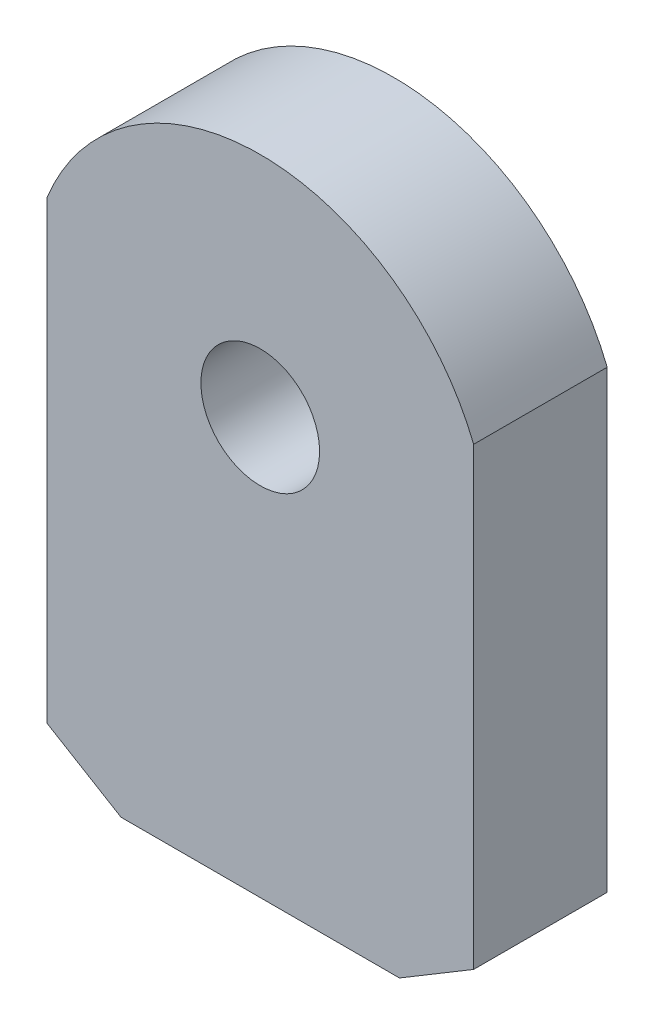
ISO-10303-21;
HEADER;
FILE_DESCRIPTION(('STEP AP214'),'2;1');
FILE_NAME('part.step','',(''),(''),'','','');
FILE_SCHEMA(('AUTOMOTIVE_DESIGN { 1 0 10303 214 1 1 1 1 }'));
ENDSEC;
DATA;
#1=APPLICATION_CONTEXT('core data for automotive mechanical design processes');
#2=APPLICATION_PROTOCOL_DEFINITION('international standard','automotive_design',2000,#1);
#3=PRODUCT_CONTEXT('',#1,'mechanical');
#4=PRODUCT('Part','Part','',(#3));
#5=PRODUCT_RELATED_PRODUCT_CATEGORY('part','',(#4));
#6=PRODUCT_DEFINITION_FORMATION('','',#4);
#7=PRODUCT_DEFINITION_CONTEXT('part definition',#1,'design');
#8=PRODUCT_DEFINITION('design','',#6,#7);
#9=PRODUCT_DEFINITION_SHAPE('','',#8);
#10=(LENGTH_UNIT() NAMED_UNIT(*) SI_UNIT(.MILLI.,.METRE.));
#11=(NAMED_UNIT(*) PLANE_ANGLE_UNIT() SI_UNIT($,.RADIAN.));
#12=(NAMED_UNIT(*) SI_UNIT($,.STERADIAN.) SOLID_ANGLE_UNIT());
#13=UNCERTAINTY_MEASURE_WITH_UNIT(LENGTH_MEASURE(1.E-05),#10,'distance_accuracy_value','');
#14=(GEOMETRIC_REPRESENTATION_CONTEXT(3) GLOBAL_UNCERTAINTY_ASSIGNED_CONTEXT((#13)) GLOBAL_UNIT_ASSIGNED_CONTEXT((#10,
#11,#12)) REPRESENTATION_CONTEXT('',''));
#15=CARTESIAN_POINT('',(0.,0.,0.));
#16=DIRECTION('',(0.,0.,1.));
#17=DIRECTION('',(1.,0.,0.));
#18=AXIS2_PLACEMENT_3D('',#15,#16,#17);
#19=CARTESIAN_POINT('',(0.,-0.16,9.));
#20=DIRECTION('',(0.,0.,1.));
#21=DIRECTION('',(1.,0.,0.));
#22=AXIS2_PLACEMENT_3D('',#19,#20,#21);
#23=PLANE('',#22);
#24=DIRECTION('',(0.,-1.,0.));
#25=VECTOR('',#24,1.);
#26=CARTESIAN_POINT('',(-14.385,5.61250162407946,9.));
#27=LINE('',#26,#25);
#28=CARTESIAN_POINT('',(-14.385,5.61250162407946,9.));
#29=VERTEX_POINT('',#28);
#30=CARTESIAN_POINT('',(-14.385,-25.04,9.));
#31=VERTEX_POINT('',#30);
#32=EDGE_CURVE('E82',#29,#31,#27,.T.);
#33=ORIENTED_EDGE('',*,*,#32,.T.);
#34=DIRECTION('',(-0.857492925712545,0.514495755427525,0.));
#35=VECTOR('',#34,1.);
#36=CARTESIAN_POINT('',(-14.7842647058823,-24.8004411764706,9.));
#37=LINE('',#36,#35);
#38=CARTESIAN_POINT('',(-9.38499999999996,-28.04,9.));
#39=VERTEX_POINT('',#38);
#40=EDGE_CURVE('E11',#31,#39,#37,.F.);
#41=ORIENTED_EDGE('',*,*,#40,.T.);
#42=DIRECTION('',(1.,0.,0.));
#43=VECTOR('',#42,1.);
#44=CARTESIAN_POINT('',(14.385,-28.04,9.));
#45=LINE('',#44,#43);
#46=CARTESIAN_POINT('',(9.38499999999997,-28.04,9.));
#47=VERTEX_POINT('',#46);
#48=EDGE_CURVE('E90',#39,#47,#45,.T.);
#49=ORIENTED_EDGE('',*,*,#48,.T.);
#50=DIRECTION('',(-0.857492925712545,-0.514495755427525,0.));
#51=VECTOR('',#50,1.);
#52=CARTESIAN_POINT('',(14.7842647058823,-24.8004411764706,9.));
#53=LINE('',#52,#51);
#54=CARTESIAN_POINT('',(14.385,-25.04,9.));
#55=VERTEX_POINT('',#54);
#56=EDGE_CURVE('E119',#47,#55,#53,.F.);
#57=ORIENTED_EDGE('',*,*,#56,.T.);
#58=DIRECTION('',(0.,1.,0.));
#59=VECTOR('',#58,1.);
#60=CARTESIAN_POINT('',(14.385,-28.04,9.));
#61=LINE('',#60,#59);
#62=CARTESIAN_POINT('',(14.385,5.61250162407946,9.));
#63=VERTEX_POINT('',#62);
#64=EDGE_CURVE('E96',#55,#63,#61,.T.);
#65=ORIENTED_EDGE('',*,*,#64,.T.);
#66=CARTESIAN_POINT('',(0.,-0.16,9.));
#67=DIRECTION('',(0.,0.,1.));
#68=DIRECTION('',(1.,0.,0.));
#69=AXIS2_PLACEMENT_3D('',#66,#67,#68);
#70=CIRCLE('',#69,15.5);
#71=EDGE_CURVE('E91',#63,#29,#70,.T.);
#72=ORIENTED_EDGE('',*,*,#71,.T.);
#73=EDGE_LOOP('',(#33,#41,#49,#57,#65,#72));
#74=FACE_BOUND('',#73,.T.);
#75=CARTESIAN_POINT('',(0.,0.,9.));
#76=DIRECTION('',(0.,0.,1.));
#77=DIRECTION('',(1.,0.,0.));
#78=AXIS2_PLACEMENT_3D('',#75,#76,#77);
#79=CIRCLE('',#78,4.);
#80=CARTESIAN_POINT('',(4.,0.,9.));
#81=VERTEX_POINT('',#80);
#82=EDGE_CURVE('E139',#81,#81,#79,.T.);
#83=ORIENTED_EDGE('',*,*,#82,.F.);
#84=EDGE_LOOP('',(#83));
#85=FACE_BOUND('',#84,.T.);
#86=ADVANCED_FACE('F33',(#74,#85),#23,.T.);
#87=CARTESIAN_POINT('',(0.,-0.16,0.));
#88=DIRECTION('',(0.,0.,1.));
#89=DIRECTION('',(1.,0.,0.));
#90=AXIS2_PLACEMENT_3D('',#87,#88,#89);
#91=PLANE('',#90);
#92=DIRECTION('',(1.,0.,0.));
#93=VECTOR('',#92,1.);
#94=CARTESIAN_POINT('',(14.385,-28.04,0.));
#95=LINE('',#94,#93);
#96=CARTESIAN_POINT('',(-9.38499999999996,-28.04,0.));
#97=VERTEX_POINT('',#96);
#98=CARTESIAN_POINT('',(9.38499999999997,-28.04,0.));
#99=VERTEX_POINT('',#98);
#100=EDGE_CURVE('E128',#97,#99,#95,.T.);
#101=ORIENTED_EDGE('',*,*,#100,.F.);
#102=DIRECTION('',(0.857492925712545,-0.514495755427525,0.));
#103=VECTOR('',#102,1.);
#104=CARTESIAN_POINT('',(-9.38499999999997,-28.04,0.));
#105=LINE('',#104,#103);
#106=CARTESIAN_POINT('',(-14.385,-25.04,0.));
#107=VERTEX_POINT('',#106);
#108=EDGE_CURVE('E55',#97,#107,#105,.F.);
#109=ORIENTED_EDGE('',*,*,#108,.T.);
#110=DIRECTION('',(0.,-1.,0.));
#111=VECTOR('',#110,1.);
#112=CARTESIAN_POINT('',(-14.385,-28.04,0.));
#113=LINE('',#112,#111);
#114=CARTESIAN_POINT('',(-14.385,5.61250162407946,0.));
#115=VERTEX_POINT('',#114);
#116=EDGE_CURVE('E134',#115,#107,#113,.T.);
#117=ORIENTED_EDGE('',*,*,#116,.F.);
#118=CARTESIAN_POINT('',(0.,-0.16,0.));
#119=DIRECTION('',(0.,0.,1.));
#120=DIRECTION('',(1.,0.,0.));
#121=AXIS2_PLACEMENT_3D('',#118,#119,#120);
#122=CIRCLE('',#121,15.5);
#123=CARTESIAN_POINT('',(14.385,5.61250162407946,0.));
#124=VERTEX_POINT('',#123);
#125=EDGE_CURVE('E104',#124,#115,#122,.T.);
#126=ORIENTED_EDGE('',*,*,#125,.F.);
#127=DIRECTION('',(0.,1.,0.));
#128=VECTOR('',#127,1.);
#129=CARTESIAN_POINT('',(14.385,5.61250162407946,0.));
#130=LINE('',#129,#128);
#131=CARTESIAN_POINT('',(14.385,-25.04,0.));
#132=VERTEX_POINT('',#131);
#133=EDGE_CURVE('E100',#132,#124,#130,.T.);
#134=ORIENTED_EDGE('',*,*,#133,.F.);
#135=DIRECTION('',(0.857492925712545,0.514495755427525,0.));
#136=VECTOR('',#135,1.);
#137=CARTESIAN_POINT('',(14.385,-25.04,0.));
#138=LINE('',#137,#136);
#139=EDGE_CURVE('E109',#132,#99,#138,.F.);
#140=ORIENTED_EDGE('',*,*,#139,.T.);
#141=EDGE_LOOP('',(#101,#109,#117,#126,#134,#140));
#142=FACE_BOUND('',#141,.T.);
#143=CARTESIAN_POINT('',(0.,0.,0.));
#144=DIRECTION('',(0.,0.,1.));
#145=DIRECTION('',(1.,0.,0.));
#146=AXIS2_PLACEMENT_3D('',#143,#144,#145);
#147=CIRCLE('',#146,4.);
#148=CARTESIAN_POINT('',(4.,0.,0.));
#149=VERTEX_POINT('',#148);
#150=EDGE_CURVE('E142',#149,#149,#147,.T.);
#151=ORIENTED_EDGE('',*,*,#150,.T.);
#152=EDGE_LOOP('',(#151));
#153=FACE_BOUND('',#152,.T.);
#154=ADVANCED_FACE('F130',(#142,#153),#91,.F.);
#155=CARTESIAN_POINT('',(0.,-0.16,9.));
#156=DIRECTION('',(0.,0.,-1.));
#157=DIRECTION('',(-1.,0.,0.));
#158=AXIS2_PLACEMENT_3D('',#155,#156,#157);
#159=CYLINDRICAL_SURFACE('',#158,15.5);
#160=ORIENTED_EDGE('',*,*,#125,.T.);
#161=DIRECTION('',(0.,0.,-1.));
#162=VECTOR('',#161,1.);
#163=CARTESIAN_POINT('',(-14.385,5.61250162407946,9.));
#164=LINE('',#163,#162);
#165=EDGE_CURVE('E86',#29,#115,#164,.T.);
#166=ORIENTED_EDGE('',*,*,#165,.F.);
#167=ORIENTED_EDGE('',*,*,#71,.F.);
#168=DIRECTION('',(0.,0.,-1.));
#169=VECTOR('',#168,1.);
#170=CARTESIAN_POINT('',(14.385,5.61250162407946,9.));
#171=LINE('',#170,#169);
#172=EDGE_CURVE('E106',#63,#124,#171,.T.);
#173=ORIENTED_EDGE('',*,*,#172,.T.);
#174=EDGE_LOOP('',(#160,#166,#167,#173));
#175=FACE_BOUND('',#174,.T.);
#176=ADVANCED_FACE('F102',(#175),#159,.T.);
#177=CARTESIAN_POINT('',(-14.385,-28.04,9.));
#178=DIRECTION('',(1.,0.,0.));
#179=DIRECTION('',(0.,1.,0.));
#180=AXIS2_PLACEMENT_3D('',#177,#178,#179);
#181=PLANE('',#180);
#182=ORIENTED_EDGE('',*,*,#116,.T.);
#183=DIRECTION('',(0.,0.,1.));
#184=VECTOR('',#183,1.);
#185=CARTESIAN_POINT('',(-14.385,-25.04,9.));
#186=LINE('',#185,#184);
#187=EDGE_CURVE('E41',#107,#31,#186,.T.);
#188=ORIENTED_EDGE('',*,*,#187,.T.);
#189=ORIENTED_EDGE('',*,*,#32,.F.);
#190=ORIENTED_EDGE('',*,*,#165,.T.);
#191=EDGE_LOOP('',(#182,#188,#189,#190));
#192=FACE_BOUND('',#191,.T.);
#193=ADVANCED_FACE('F84',(#192),#181,.F.);
#194=CARTESIAN_POINT('',(14.385,-28.04,9.));
#195=DIRECTION('',(0.,1.,0.));
#196=DIRECTION('',(-1.,0.,0.));
#197=AXIS2_PLACEMENT_3D('',#194,#195,#196);
#198=PLANE('',#197);
#199=ORIENTED_EDGE('',*,*,#48,.F.);
#200=DIRECTION('',(0.,0.,-1.));
#201=VECTOR('',#200,1.);
#202=CARTESIAN_POINT('',(-9.38499999999997,-28.04,9.));
#203=LINE('',#202,#201);
#204=EDGE_CURVE('E121',#39,#97,#203,.T.);
#205=ORIENTED_EDGE('',*,*,#204,.T.);
#206=ORIENTED_EDGE('',*,*,#100,.T.);
#207=DIRECTION('',(0.,0.,1.));
#208=VECTOR('',#207,1.);
#209=CARTESIAN_POINT('',(9.38499999999997,-28.04,9.));
#210=LINE('',#209,#208);
#211=EDGE_CURVE('E116',#99,#47,#210,.T.);
#212=ORIENTED_EDGE('',*,*,#211,.T.);
#213=EDGE_LOOP('',(#199,#205,#206,#212));
#214=FACE_BOUND('',#213,.T.);
#215=ADVANCED_FACE('F127',(#214),#198,.F.);
#216=CARTESIAN_POINT('',(14.385,5.61250162407946,9.));
#217=DIRECTION('',(-1.,0.,0.));
#218=DIRECTION('',(0.,0.,1.));
#219=AXIS2_PLACEMENT_3D('',#216,#217,#218);
#220=PLANE('',#219);
#221=ORIENTED_EDGE('',*,*,#64,.F.);
#222=DIRECTION('',(0.,0.,-1.));
#223=VECTOR('',#222,1.);
#224=CARTESIAN_POINT('',(14.385,-25.04,9.));
#225=LINE('',#224,#223);
#226=EDGE_CURVE('E105',#55,#132,#225,.T.);
#227=ORIENTED_EDGE('',*,*,#226,.T.);
#228=ORIENTED_EDGE('',*,*,#133,.T.);
#229=ORIENTED_EDGE('',*,*,#172,.F.);
#230=EDGE_LOOP('',(#221,#227,#228,#229));
#231=FACE_BOUND('',#230,.T.);
#232=ADVANCED_FACE('F158',(#231),#220,.F.);
#233=CARTESIAN_POINT('',(0.,0.,9.));
#234=DIRECTION('',(0.,0.,-1.));
#235=DIRECTION('',(-1.,0.,0.));
#236=AXIS2_PLACEMENT_3D('',#233,#234,#235);
#237=CYLINDRICAL_SURFACE('',#236,4.);
#238=ORIENTED_EDGE('',*,*,#82,.T.);
#239=EDGE_LOOP('',(#238));
#240=FACE_BOUND('',#239,.T.);
#241=ORIENTED_EDGE('',*,*,#150,.F.);
#242=EDGE_LOOP('',(#241));
#243=FACE_BOUND('',#242,.T.);
#244=ADVANCED_FACE('F148',(#240,#243),#237,.F.);
#245=CARTESIAN_POINT('',(14.385,-25.04,9.));
#246=DIRECTION('',(-0.514495755427525,0.857492925712545,0.));
#247=DIRECTION('',(0.,0.,-1.));
#248=AXIS2_PLACEMENT_3D('',#245,#246,#247);
#249=PLANE('',#248);
#250=ORIENTED_EDGE('',*,*,#56,.F.);
#251=ORIENTED_EDGE('',*,*,#211,.F.);
#252=ORIENTED_EDGE('',*,*,#139,.F.);
#253=ORIENTED_EDGE('',*,*,#226,.F.);
#254=EDGE_LOOP('',(#250,#251,#252,#253));
#255=FACE_BOUND('',#254,.T.);
#256=ADVANCED_FACE('F167',(#255),#249,.F.);
#257=CARTESIAN_POINT('',(-9.38499999999997,-28.04,9.));
#258=DIRECTION('',(0.514495755427525,0.857492925712545,0.));
#259=DIRECTION('',(0.,0.,-1.));
#260=AXIS2_PLACEMENT_3D('',#257,#258,#259);
#261=PLANE('',#260);
#262=ORIENTED_EDGE('',*,*,#40,.F.);
#263=ORIENTED_EDGE('',*,*,#187,.F.);
#264=ORIENTED_EDGE('',*,*,#108,.F.);
#265=ORIENTED_EDGE('',*,*,#204,.F.);
#266=EDGE_LOOP('',(#262,#263,#264,#265));
#267=FACE_BOUND('',#266,.T.);
#268=ADVANCED_FACE('F35',(#267),#261,.F.);
#269=CLOSED_SHELL('',(#86,#154,#176,#193,#215,#232,#244,#256,#268));
#270=MANIFOLD_SOLID_BREP('B2',#269);
#271=ADVANCED_BREP_SHAPE_REPRESENTATION('',(#18,#270),#14);
#272=SHAPE_DEFINITION_REPRESENTATION(#9,#271);
ENDSEC;
END-ISO-10303-21;
